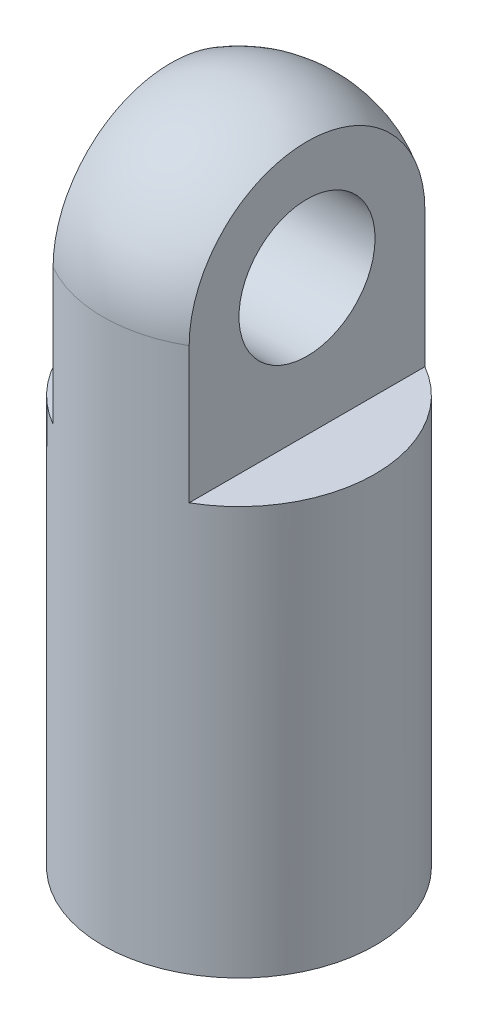
ISO-10303-21;
HEADER;
FILE_DESCRIPTION(('STEP AP214'),'2;1');
FILE_NAME('part.step','',(''),(''),'','','');
FILE_SCHEMA(('AUTOMOTIVE_DESIGN { 1 0 10303 214 1 1 1 1 }'));
ENDSEC;
DATA;
#1=APPLICATION_CONTEXT('core data for automotive mechanical design processes');
#2=APPLICATION_PROTOCOL_DEFINITION('international standard','automotive_design',2000,#1);
#3=PRODUCT_CONTEXT('',#1,'mechanical');
#4=PRODUCT('Part','Part','',(#3));
#5=PRODUCT_RELATED_PRODUCT_CATEGORY('part','',(#4));
#6=PRODUCT_DEFINITION_FORMATION('','',#4);
#7=PRODUCT_DEFINITION_CONTEXT('part definition',#1,'design');
#8=PRODUCT_DEFINITION('design','',#6,#7);
#9=PRODUCT_DEFINITION_SHAPE('','',#8);
#10=(LENGTH_UNIT() NAMED_UNIT(*) SI_UNIT(.MILLI.,.METRE.));
#11=(NAMED_UNIT(*) PLANE_ANGLE_UNIT() SI_UNIT($,.RADIAN.));
#12=(NAMED_UNIT(*) SI_UNIT($,.STERADIAN.) SOLID_ANGLE_UNIT());
#13=UNCERTAINTY_MEASURE_WITH_UNIT(LENGTH_MEASURE(1.E-05),#10,'distance_accuracy_value','');
#14=(GEOMETRIC_REPRESENTATION_CONTEXT(3) GLOBAL_UNCERTAINTY_ASSIGNED_CONTEXT((#13)) GLOBAL_UNIT_ASSIGNED_CONTEXT((#10,
#11,#12)) REPRESENTATION_CONTEXT('',''));
#15=CARTESIAN_POINT('',(0.,0.,0.));
#16=DIRECTION('',(0.,0.,1.));
#17=DIRECTION('',(1.,0.,0.));
#18=AXIS2_PLACEMENT_3D('',#15,#16,#17);
#19=CARTESIAN_POINT('',(0.,32.,0.));
#20=DIRECTION('',(0.,-1.,0.));
#21=DIRECTION('',(0.,0.,-1.));
#22=AXIS2_PLACEMENT_3D('',#19,#20,#21);
#23=CYLINDRICAL_SURFACE('',#22,8.);
#24=CARTESIAN_POINT('',(0.,32.,0.));
#25=DIRECTION('',(0.,1.,0.));
#26=DIRECTION('',(0.,0.,1.));
#27=AXIS2_PLACEMENT_3D('',#24,#25,#26);
#28=CIRCLE('',#27,8.);
#29=CARTESIAN_POINT('',(-4.,32.,6.92820323027551));
#30=VERTEX_POINT('',#29);
#31=CARTESIAN_POINT('',(4.,32.,6.92820323027551));
#32=VERTEX_POINT('',#31);
#33=EDGE_CURVE('E106',#30,#32,#28,.T.);
#34=ORIENTED_EDGE('',*,*,#33,.F.);
#35=DIRECTION('',(0.,1.,0.));
#36=VECTOR('',#35,1.);
#37=CARTESIAN_POINT('',(-4.,24.,6.92820323027551));
#38=LINE('',#37,#36);
#39=CARTESIAN_POINT('',(-4.,24.,6.92820323027551));
#40=VERTEX_POINT('',#39);
#41=EDGE_CURVE('E62',#40,#30,#38,.T.);
#42=ORIENTED_EDGE('',*,*,#41,.F.);
#43=CARTESIAN_POINT('',(0.,24.,0.));
#44=DIRECTION('',(0.,1.,0.));
#45=DIRECTION('',(0.,0.,1.));
#46=AXIS2_PLACEMENT_3D('',#43,#44,#45);
#47=CIRCLE('',#46,8.);
#48=CARTESIAN_POINT('',(-4.,24.,-6.92820323027551));
#49=VERTEX_POINT('',#48);
#50=EDGE_CURVE('E90',#49,#40,#47,.T.);
#51=ORIENTED_EDGE('',*,*,#50,.F.);
#52=DIRECTION('',(0.,1.,0.));
#53=VECTOR('',#52,1.);
#54=CARTESIAN_POINT('',(-4.,24.,-6.92820323027551));
#55=LINE('',#54,#53);
#56=CARTESIAN_POINT('',(-4.,32.,-6.92820323027551));
#57=VERTEX_POINT('',#56);
#58=EDGE_CURVE('E99',#49,#57,#55,.T.);
#59=ORIENTED_EDGE('',*,*,#58,.T.);
#60=CARTESIAN_POINT('',(4.,32.,-6.92820323027551));
#61=VERTEX_POINT('',#60);
#62=EDGE_CURVE('E126',#61,#57,#28,.T.);
#63=ORIENTED_EDGE('',*,*,#62,.F.);
#64=DIRECTION('',(0.,1.,0.));
#65=VECTOR('',#64,1.);
#66=CARTESIAN_POINT('',(4.,24.,-6.92820323027551));
#67=LINE('',#66,#65);
#68=CARTESIAN_POINT('',(4.,24.,-6.92820323027551));
#69=VERTEX_POINT('',#68);
#70=EDGE_CURVE('E70',#69,#61,#67,.T.);
#71=ORIENTED_EDGE('',*,*,#70,.F.);
#72=CARTESIAN_POINT('',(0.,24.,0.));
#73=DIRECTION('',(0.,1.,0.));
#74=DIRECTION('',(0.,0.,1.));
#75=AXIS2_PLACEMENT_3D('',#72,#73,#74);
#76=CIRCLE('',#75,8.);
#77=CARTESIAN_POINT('',(4.,24.,6.92820323027551));
#78=VERTEX_POINT('',#77);
#79=EDGE_CURVE('E96',#78,#69,#76,.T.);
#80=ORIENTED_EDGE('',*,*,#79,.F.);
#81=DIRECTION('',(0.,1.,0.));
#82=VECTOR('',#81,1.);
#83=CARTESIAN_POINT('',(4.,24.,6.92820323027551));
#84=LINE('',#83,#82);
#85=EDGE_CURVE('E116',#78,#32,#84,.T.);
#86=ORIENTED_EDGE('',*,*,#85,.T.);
#87=EDGE_LOOP('',(#34,#42,#51,#59,#63,#71,#80,#86));
#88=FACE_BOUND('',#87,.T.);
#89=CARTESIAN_POINT('',(0.,0.,0.));
#90=DIRECTION('',(0.,1.,0.));
#91=DIRECTION('',(0.,0.,1.));
#92=AXIS2_PLACEMENT_3D('',#89,#90,#91);
#93=CIRCLE('',#92,8.);
#94=CARTESIAN_POINT('',(0.,0.,8.));
#95=VERTEX_POINT('',#94);
#96=EDGE_CURVE('E110',#95,#95,#93,.T.);
#97=ORIENTED_EDGE('',*,*,#96,.T.);
#98=EDGE_LOOP('',(#97));
#99=FACE_BOUND('',#98,.T.);
#100=ADVANCED_FACE('F47',(#88,#99),#23,.T.);
#101=CARTESIAN_POINT('',(0.,0.,0.));
#102=DIRECTION('',(0.,1.,0.));
#103=DIRECTION('',(0.,0.,1.));
#104=AXIS2_PLACEMENT_3D('',#101,#102,#103);
#105=PLANE('',#104);
#106=ORIENTED_EDGE('',*,*,#96,.F.);
#107=EDGE_LOOP('',(#106));
#108=FACE_BOUND('',#107,.T.);
#109=ADVANCED_FACE('F150',(#108),#105,.F.);
#110=CARTESIAN_POINT('',(0.,32.,0.));
#111=DIRECTION('',(0.,-1.,0.));
#112=DIRECTION('',(-1.,0.,0.));
#113=AXIS2_PLACEMENT_3D('',#110,#111,#112);
#114=SPHERICAL_SURFACE('',#113,8.);
#115=CARTESIAN_POINT('',(-4.,32.,0.));
#116=DIRECTION('',(1.,0.,0.));
#117=DIRECTION('',(0.,0.,-1.));
#118=AXIS2_PLACEMENT_3D('',#115,#116,#117);
#119=CIRCLE('',#118,6.92820323027551);
#120=EDGE_CURVE('E11',#30,#57,#119,.F.);
#121=ORIENTED_EDGE('',*,*,#120,.F.);
#122=ORIENTED_EDGE('',*,*,#33,.T.);
#123=CARTESIAN_POINT('',(4.,32.,0.));
#124=DIRECTION('',(-1.,0.,0.));
#125=DIRECTION('',(0.,0.,1.));
#126=AXIS2_PLACEMENT_3D('',#123,#124,#125);
#127=CIRCLE('',#126,6.92820323027551);
#128=EDGE_CURVE('E56',#61,#32,#127,.F.);
#129=ORIENTED_EDGE('',*,*,#128,.F.);
#130=ORIENTED_EDGE('',*,*,#62,.T.);
#131=EDGE_LOOP('',(#121,#122,#129,#130));
#132=FACE_BOUND('',#131,.T.);
#133=ADVANCED_FACE('F135',(#132),#114,.T.);
#134=CARTESIAN_POINT('',(4.,24.,6.92820323027551));
#135=DIRECTION('',(-1.,0.,0.));
#136=DIRECTION('',(0.,0.,1.));
#137=AXIS2_PLACEMENT_3D('',#134,#135,#136);
#138=PLANE('',#137);
#139=CARTESIAN_POINT('',(4.,32.,0.));
#140=DIRECTION('',(1.,0.,0.));
#141=DIRECTION('',(0.,0.,-1.));
#142=AXIS2_PLACEMENT_3D('',#139,#140,#141);
#143=CIRCLE('',#142,4.);
#144=CARTESIAN_POINT('',(4.,32.,-4.));
#145=VERTEX_POINT('',#144);
#146=EDGE_CURVE('E211',#145,#145,#143,.T.);
#147=ORIENTED_EDGE('',*,*,#146,.F.);
#148=EDGE_LOOP('',(#147));
#149=FACE_BOUND('',#148,.T.);
#150=ORIENTED_EDGE('',*,*,#128,.T.);
#151=ORIENTED_EDGE('',*,*,#85,.F.);
#152=DIRECTION('',(0.,0.,1.));
#153=VECTOR('',#152,1.);
#154=CARTESIAN_POINT('',(4.,24.,6.92820323027551));
#155=LINE('',#154,#153);
#156=EDGE_CURVE('E115',#69,#78,#155,.T.);
#157=ORIENTED_EDGE('',*,*,#156,.F.);
#158=ORIENTED_EDGE('',*,*,#70,.T.);
#159=EDGE_LOOP('',(#150,#151,#157,#158));
#160=FACE_BOUND('',#159,.T.);
#161=ADVANCED_FACE('F139',(#149,#160),#138,.F.);
#162=CARTESIAN_POINT('',(0.,24.,0.));
#163=DIRECTION('',(0.,1.,0.));
#164=DIRECTION('',(0.,0.,1.));
#165=AXIS2_PLACEMENT_3D('',#162,#163,#164);
#166=PLANE('',#165);
#167=ORIENTED_EDGE('',*,*,#79,.T.);
#168=ORIENTED_EDGE('',*,*,#156,.T.);
#169=EDGE_LOOP('',(#167,#168));
#170=FACE_BOUND('',#169,.T.);
#171=ADVANCED_FACE('F138',(#170),#166,.T.);
#172=CARTESIAN_POINT('',(-4.,24.,6.92820323027551));
#173=DIRECTION('',(1.,0.,0.));
#174=DIRECTION('',(0.,0.,-1.));
#175=AXIS2_PLACEMENT_3D('',#172,#173,#174);
#176=PLANE('',#175);
#177=CARTESIAN_POINT('',(-4.,32.,0.));
#178=DIRECTION('',(1.,0.,0.));
#179=DIRECTION('',(0.,0.,-1.));
#180=AXIS2_PLACEMENT_3D('',#177,#178,#179);
#181=CIRCLE('',#180,4.);
#182=CARTESIAN_POINT('',(-4.,32.,-4.));
#183=VERTEX_POINT('',#182);
#184=EDGE_CURVE('E50',#183,#183,#181,.T.);
#185=ORIENTED_EDGE('',*,*,#184,.T.);
#186=EDGE_LOOP('',(#185));
#187=FACE_BOUND('',#186,.T.);
#188=ORIENTED_EDGE('',*,*,#120,.T.);
#189=ORIENTED_EDGE('',*,*,#58,.F.);
#190=DIRECTION('',(0.,0.,-1.));
#191=VECTOR('',#190,1.);
#192=CARTESIAN_POINT('',(-4.,24.,6.92820323027551));
#193=LINE('',#192,#191);
#194=EDGE_CURVE('E92',#40,#49,#193,.T.);
#195=ORIENTED_EDGE('',*,*,#194,.F.);
#196=ORIENTED_EDGE('',*,*,#41,.T.);
#197=EDGE_LOOP('',(#188,#189,#195,#196));
#198=FACE_BOUND('',#197,.T.);
#199=ADVANCED_FACE('F98',(#187,#198),#176,.F.);
#200=CARTESIAN_POINT('',(0.,24.,0.));
#201=DIRECTION('',(0.,1.,0.));
#202=DIRECTION('',(0.,0.,1.));
#203=AXIS2_PLACEMENT_3D('',#200,#201,#202);
#204=PLANE('',#203);
#205=ORIENTED_EDGE('',*,*,#50,.T.);
#206=ORIENTED_EDGE('',*,*,#194,.T.);
#207=EDGE_LOOP('',(#205,#206));
#208=FACE_BOUND('',#207,.T.);
#209=ADVANCED_FACE('F91',(#208),#204,.T.);
#210=CARTESIAN_POINT('',(-8.,32.,0.));
#211=DIRECTION('',(1.,0.,0.));
#212=DIRECTION('',(0.,0.,-1.));
#213=AXIS2_PLACEMENT_3D('',#210,#211,#212);
#214=CYLINDRICAL_SURFACE('',#213,4.);
#215=ORIENTED_EDGE('',*,*,#146,.T.);
#216=EDGE_LOOP('',(#215));
#217=FACE_BOUND('',#216,.T.);
#218=ORIENTED_EDGE('',*,*,#184,.F.);
#219=EDGE_LOOP('',(#218));
#220=FACE_BOUND('',#219,.T.);
#221=ADVANCED_FACE('F198',(#217,#220),#214,.F.);
#222=CLOSED_SHELL('',(#100,#109,#133,#161,#171,#199,#209,#221));
#223=MANIFOLD_SOLID_BREP('B2',#222);
#224=ADVANCED_BREP_SHAPE_REPRESENTATION('',(#18,#223),#14);
#225=SHAPE_DEFINITION_REPRESENTATION(#9,#224);
ENDSEC;
END-ISO-10303-21;
